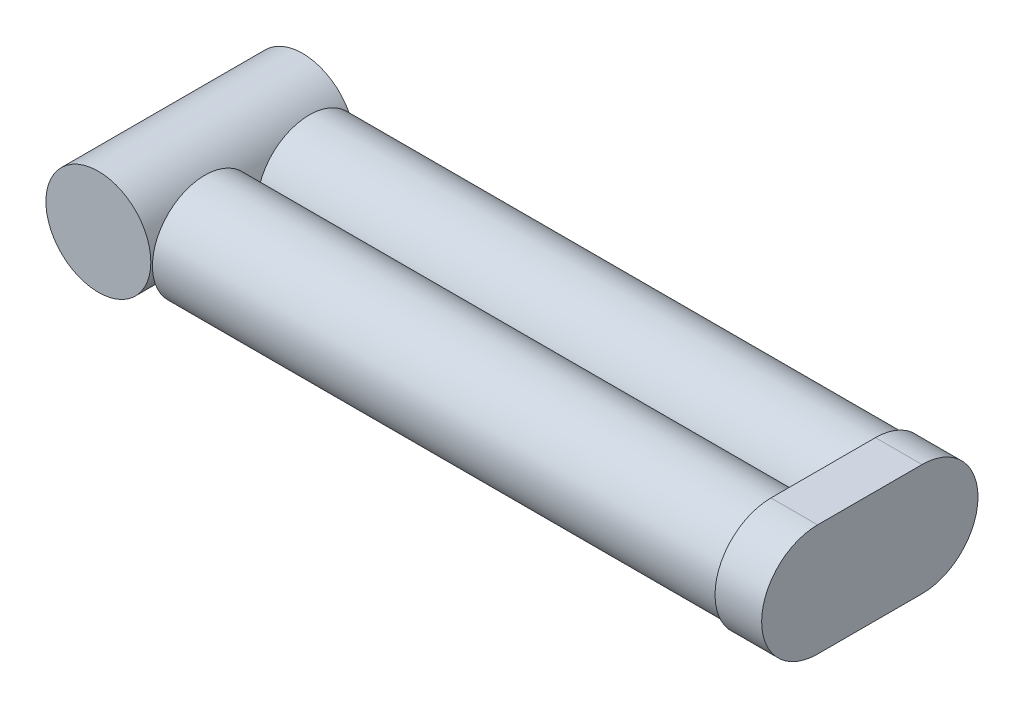
ISO-10303-21;
HEADER;
FILE_DESCRIPTION(('STEP AP214'),'2;1');
FILE_NAME('part.step','',(''),(''),'','','');
FILE_SCHEMA(('AUTOMOTIVE_DESIGN { 1 0 10303 214 1 1 1 1 }'));
ENDSEC;
DATA;
#1=APPLICATION_CONTEXT('core data for automotive mechanical design processes');
#2=APPLICATION_PROTOCOL_DEFINITION('international standard','automotive_design',2000,#1);
#3=PRODUCT_CONTEXT('',#1,'mechanical');
#4=PRODUCT('Part','Part','',(#3));
#5=PRODUCT_RELATED_PRODUCT_CATEGORY('part','',(#4));
#6=PRODUCT_DEFINITION_FORMATION('','',#4);
#7=PRODUCT_DEFINITION_CONTEXT('part definition',#1,'design');
#8=PRODUCT_DEFINITION('design','',#6,#7);
#9=PRODUCT_DEFINITION_SHAPE('','',#8);
#10=(LENGTH_UNIT() NAMED_UNIT(*) SI_UNIT(.MILLI.,.METRE.));
#11=(NAMED_UNIT(*) PLANE_ANGLE_UNIT() SI_UNIT($,.RADIAN.));
#12=(NAMED_UNIT(*) SI_UNIT($,.STERADIAN.) SOLID_ANGLE_UNIT());
#13=UNCERTAINTY_MEASURE_WITH_UNIT(LENGTH_MEASURE(1.E-05),#10,'distance_accuracy_value','');
#14=(GEOMETRIC_REPRESENTATION_CONTEXT(3) GLOBAL_UNCERTAINTY_ASSIGNED_CONTEXT((#13)) GLOBAL_UNIT_ASSIGNED_CONTEXT((#10,
#11,#12)) REPRESENTATION_CONTEXT('',''));
#15=CARTESIAN_POINT('',(0.,0.,0.));
#16=DIRECTION('',(0.,0.,1.));
#17=DIRECTION('',(1.,0.,0.));
#18=AXIS2_PLACEMENT_3D('',#15,#16,#17);
#19=CARTESIAN_POINT('',(-12.15,0.,21.9));
#20=DIRECTION('',(0.,0.,-1.));
#21=DIRECTION('',(-1.,0.,0.));
#22=AXIS2_PLACEMENT_3D('',#19,#20,#21);
#23=CYLINDRICAL_SURFACE('',#22,11.25);
#24=CARTESIAN_POINT('',(-12.15,0.,21.9));
#25=DIRECTION('',(0.,0.,1.));
#26=DIRECTION('',(1.,0.,0.));
#27=AXIS2_PLACEMENT_3D('',#24,#25,#26);
#28=CIRCLE('',#27,11.25);
#29=CARTESIAN_POINT('',(-0.90000000000001,0.,21.9));
#30=VERTEX_POINT('',#29);
#31=EDGE_CURVE('E11',#30,#30,#28,.T.);
#32=ORIENTED_EDGE('',*,*,#31,.F.);
#33=EDGE_LOOP('',(#32));
#34=FACE_BOUND('',#33,.T.);
#35=CARTESIAN_POINT('',(-12.15,0.,-21.9));
#36=DIRECTION('',(0.,0.,1.));
#37=DIRECTION('',(1.,0.,0.));
#38=AXIS2_PLACEMENT_3D('',#35,#36,#37);
#39=CIRCLE('',#38,11.25);
#40=CARTESIAN_POINT('',(-0.90000000000001,0.,-21.9));
#41=VERTEX_POINT('',#40);
#42=EDGE_CURVE('E55',#41,#41,#39,.T.);
#43=ORIENTED_EDGE('',*,*,#42,.T.);
#44=EDGE_LOOP('',(#43));
#45=FACE_BOUND('',#44,.T.);
#46=ADVANCED_FACE('F52',(#34,#45),#23,.T.);
#47=CARTESIAN_POINT('',(-12.15,0.,21.9));
#48=DIRECTION('',(0.,0.,1.));
#49=DIRECTION('',(1.,0.,0.));
#50=AXIS2_PLACEMENT_3D('',#47,#48,#49);
#51=PLANE('',#50);
#52=ORIENTED_EDGE('',*,*,#31,.T.);
#53=EDGE_LOOP('',(#52));
#54=FACE_BOUND('',#53,.T.);
#55=ADVANCED_FACE('F67',(#54),#51,.T.);
#56=CARTESIAN_POINT('',(-12.15,0.,-21.9));
#57=DIRECTION('',(0.,0.,1.));
#58=DIRECTION('',(1.,0.,0.));
#59=AXIS2_PLACEMENT_3D('',#56,#57,#58);
#60=PLANE('',#59);
#61=ORIENTED_EDGE('',*,*,#42,.F.);
#62=EDGE_LOOP('',(#61));
#63=FACE_BOUND('',#62,.T.);
#64=ADVANCED_FACE('F65',(#63),#60,.F.);
#65=CLOSED_SHELL('',(#46,#55,#64));
#66=MANIFOLD_SOLID_BREP('B2',#65);
#67=CARTESIAN_POINT('',(130.4,0.,-11.2));
#68=DIRECTION('',(1.,0.,0.));
#69=DIRECTION('',(0.,0.,-1.));
#70=AXIS2_PLACEMENT_3D('',#67,#68,#69);
#71=PLANE('',#70);
#72=CARTESIAN_POINT('',(130.4,0.,-11.2));
#73=DIRECTION('',(1.,0.,0.));
#74=DIRECTION('',(0.,0.,-1.));
#75=AXIS2_PLACEMENT_3D('',#72,#73,#74);
#76=CIRCLE('',#75,11.25);
#77=CARTESIAN_POINT('',(130.4,-11.,-8.84150471698584));
#78=VERTEX_POINT('',#77);
#79=CARTESIAN_POINT('',(130.4,-1.05948100502087,0.));
#80=VERTEX_POINT('',#79);
#81=EDGE_CURVE('E267',#78,#80,#76,.F.);
#82=ORIENTED_EDGE('',*,*,#81,.F.);
#83=DIRECTION('',(0.,0.,1.));
#84=VECTOR('',#83,1.);
#85=CARTESIAN_POINT('',(130.4,-11.,-11.2));
#86=LINE('',#85,#84);
#87=CARTESIAN_POINT('',(130.4,-11.,8.84150471698586));
#88=VERTEX_POINT('',#87);
#89=EDGE_CURVE('E324',#78,#88,#86,.T.);
#90=ORIENTED_EDGE('',*,*,#89,.T.);
#91=CARTESIAN_POINT('',(130.4,0.,11.2));
#92=DIRECTION('',(1.,0.,0.));
#93=DIRECTION('',(0.,0.,-1.));
#94=AXIS2_PLACEMENT_3D('',#91,#92,#93);
#95=CIRCLE('',#94,11.25);
#96=EDGE_CURVE('E118',#88,#80,#95,.T.);
#97=ORIENTED_EDGE('',*,*,#96,.T.);
#98=EDGE_LOOP('',(#82,#90,#97));
#99=FACE_BOUND('',#98,.T.);
#100=ADVANCED_FACE('F94',(#99),#71,.F.);
#101=CARTESIAN_POINT('',(131.4,0.,11.2));
#102=DIRECTION('',(-1.,0.,0.));
#103=DIRECTION('',(0.,0.,1.));
#104=AXIS2_PLACEMENT_3D('',#101,#102,#103);
#105=CYLINDRICAL_SURFACE('',#104,11.25);
#106=ORIENTED_EDGE('',*,*,#96,.F.);
#107=DIRECTION('',(-1.,0.,0.));
#108=VECTOR('',#107,1.);
#109=CARTESIAN_POINT('',(131.4,-11.,8.84150471698586));
#110=LINE('',#109,#108);
#111=CARTESIAN_POINT('',(121.4,-11.,8.84150471698586));
#112=VERTEX_POINT('',#111);
#113=EDGE_CURVE('E223',#88,#112,#110,.T.);
#114=ORIENTED_EDGE('',*,*,#113,.T.);
#115=CARTESIAN_POINT('',(121.4,0.,11.2));
#116=DIRECTION('',(1.,0.,0.));
#117=DIRECTION('',(0.,0.,-1.));
#118=AXIS2_PLACEMENT_3D('',#115,#116,#117);
#119=CIRCLE('',#118,11.25);
#120=CARTESIAN_POINT('',(121.4,11.,8.84150471698588));
#121=VERTEX_POINT('',#120);
#122=EDGE_CURVE('E227',#121,#112,#119,.T.);
#123=ORIENTED_EDGE('',*,*,#122,.F.);
#124=DIRECTION('',(-1.,0.,0.));
#125=VECTOR('',#124,1.);
#126=CARTESIAN_POINT('',(131.4,11.,8.84150471698588));
#127=LINE('',#126,#125);
#128=CARTESIAN_POINT('',(130.4,11.,8.84150471698588));
#129=VERTEX_POINT('',#128);
#130=EDGE_CURVE('E216',#121,#129,#127,.F.);
#131=ORIENTED_EDGE('',*,*,#130,.T.);
#132=CARTESIAN_POINT('',(130.4,1.05948100502087,0.));
#133=VERTEX_POINT('',#132);
#134=EDGE_CURVE('E250',#133,#129,#95,.T.);
#135=ORIENTED_EDGE('',*,*,#134,.F.);
#136=DIRECTION('',(-1.,0.,0.));
#137=VECTOR('',#136,1.);
#138=CARTESIAN_POINT('',(131.4,1.05948100502087,0.));
#139=LINE('',#138,#137);
#140=CARTESIAN_POINT('',(0.,1.05948100502087,0.));
#141=VERTEX_POINT('',#140);
#142=EDGE_CURVE('E262',#133,#141,#139,.T.);
#143=ORIENTED_EDGE('',*,*,#142,.T.);
#144=CARTESIAN_POINT('',(0.,0.,11.2));
#145=DIRECTION('',(1.,0.,0.));
#146=DIRECTION('',(0.,0.,-1.));
#147=AXIS2_PLACEMENT_3D('',#144,#145,#146);
#148=CIRCLE('',#147,11.25);
#149=CARTESIAN_POINT('',(0.,-1.05948100502087,0.));
#150=VERTEX_POINT('',#149);
#151=EDGE_CURVE('E254',#141,#150,#148,.T.);
#152=ORIENTED_EDGE('',*,*,#151,.T.);
#153=DIRECTION('',(-1.,0.,0.));
#154=VECTOR('',#153,1.);
#155=CARTESIAN_POINT('',(131.4,-1.05948100502087,0.));
#156=LINE('',#155,#154);
#157=EDGE_CURVE('E265',#80,#150,#156,.T.);
#158=ORIENTED_EDGE('',*,*,#157,.F.);
#159=EDGE_LOOP('',(#106,#114,#123,#131,#135,#143,#152,#158));
#160=FACE_BOUND('',#159,.T.);
#161=ADVANCED_FACE('F96',(#160),#105,.T.);
#162=CARTESIAN_POINT('',(131.4,0.,-11.2));
#163=DIRECTION('',(-1.,0.,0.));
#164=DIRECTION('',(0.,0.,1.));
#165=AXIS2_PLACEMENT_3D('',#162,#163,#164);
#166=CYLINDRICAL_SURFACE('',#165,11.25);
#167=DIRECTION('',(-1.,0.,0.));
#168=VECTOR('',#167,1.);
#169=CARTESIAN_POINT('',(131.4,-11.,-8.84150471698584));
#170=LINE('',#169,#168);
#171=CARTESIAN_POINT('',(121.4,-11.,-8.84150471698584));
#172=VERTEX_POINT('',#171);
#173=EDGE_CURVE('E220',#78,#172,#170,.T.);
#174=ORIENTED_EDGE('',*,*,#173,.F.);
#175=ORIENTED_EDGE('',*,*,#81,.T.);
#176=ORIENTED_EDGE('',*,*,#157,.T.);
#177=CARTESIAN_POINT('',(0.,0.,-11.2));
#178=DIRECTION('',(1.,0.,0.));
#179=DIRECTION('',(0.,0.,-1.));
#180=AXIS2_PLACEMENT_3D('',#177,#178,#179);
#181=CIRCLE('',#180,11.25);
#182=EDGE_CURVE('E258',#141,#150,#181,.F.);
#183=ORIENTED_EDGE('',*,*,#182,.F.);
#184=ORIENTED_EDGE('',*,*,#142,.F.);
#185=CARTESIAN_POINT('',(130.4,11.,-8.84150471698584));
#186=VERTEX_POINT('',#185);
#187=EDGE_CURVE('E103',#133,#186,#76,.F.);
#188=ORIENTED_EDGE('',*,*,#187,.T.);
#189=DIRECTION('',(-1.,0.,0.));
#190=VECTOR('',#189,1.);
#191=CARTESIAN_POINT('',(131.4,11.,-8.84150471698584));
#192=LINE('',#191,#190);
#193=CARTESIAN_POINT('',(121.4,11.,-8.84150471698584));
#194=VERTEX_POINT('',#193);
#195=EDGE_CURVE('E110',#194,#186,#192,.F.);
#196=ORIENTED_EDGE('',*,*,#195,.F.);
#197=CARTESIAN_POINT('',(121.4,0.,-11.2));
#198=DIRECTION('',(1.,0.,0.));
#199=DIRECTION('',(0.,0.,-1.));
#200=AXIS2_PLACEMENT_3D('',#197,#198,#199);
#201=CIRCLE('',#200,11.25);
#202=EDGE_CURVE('E50',#194,#172,#201,.F.);
#203=ORIENTED_EDGE('',*,*,#202,.T.);
#204=EDGE_LOOP('',(#174,#175,#176,#183,#184,#188,#196,#203));
#205=FACE_BOUND('',#204,.T.);
#206=ADVANCED_FACE('F275',(#205),#166,.T.);
#207=CARTESIAN_POINT('',(0.,0.,0.));
#208=DIRECTION('',(1.,0.,0.));
#209=DIRECTION('',(0.,0.,-1.));
#210=AXIS2_PLACEMENT_3D('',#207,#208,#209);
#211=PLANE('',#210);
#212=ORIENTED_EDGE('',*,*,#151,.F.);
#213=ORIENTED_EDGE('',*,*,#182,.T.);
#214=EDGE_LOOP('',(#212,#213));
#215=FACE_BOUND('',#214,.T.);
#216=ADVANCED_FACE('F281',(#215),#211,.F.);
#217=ORIENTED_EDGE('',*,*,#134,.T.);
#218=DIRECTION('',(0.,0.,-1.));
#219=VECTOR('',#218,1.);
#220=CARTESIAN_POINT('',(130.4,11.,11.2));
#221=LINE('',#220,#219);
#222=EDGE_CURVE('E322',#129,#186,#221,.T.);
#223=ORIENTED_EDGE('',*,*,#222,.T.);
#224=ORIENTED_EDGE('',*,*,#187,.F.);
#225=EDGE_LOOP('',(#217,#223,#224));
#226=FACE_BOUND('',#225,.T.);
#227=ADVANCED_FACE('F283',(#226),#71,.F.);
#228=CARTESIAN_POINT('',(121.4,0.,0.));
#229=DIRECTION('',(1.,0.,0.));
#230=DIRECTION('',(0.,0.,-1.));
#231=AXIS2_PLACEMENT_3D('',#228,#229,#230);
#232=PLANE('',#231);
#233=DIRECTION('',(0.,0.,-1.));
#234=VECTOR('',#233,1.);
#235=CARTESIAN_POINT('',(121.4,-12.,-11.2));
#236=LINE('',#235,#234);
#237=CARTESIAN_POINT('',(121.4,-12.,11.2));
#238=VERTEX_POINT('',#237);
#239=CARTESIAN_POINT('',(121.4,-12.,-11.2));
#240=VERTEX_POINT('',#239);
#241=EDGE_CURVE('E178',#238,#240,#236,.T.);
#242=ORIENTED_EDGE('',*,*,#241,.F.);
#243=CARTESIAN_POINT('',(121.4,0.,11.2));
#244=DIRECTION('',(1.,0.,0.));
#245=DIRECTION('',(0.,0.,-1.));
#246=AXIS2_PLACEMENT_3D('',#243,#244,#245);
#247=CIRCLE('',#246,12.);
#248=CARTESIAN_POINT('',(121.4,12.,11.2));
#249=VERTEX_POINT('',#248);
#250=EDGE_CURVE('E195',#249,#238,#247,.T.);
#251=ORIENTED_EDGE('',*,*,#250,.F.);
#252=DIRECTION('',(0.,0.,1.));
#253=VECTOR('',#252,1.);
#254=CARTESIAN_POINT('',(121.4,12.,11.2));
#255=LINE('',#254,#253);
#256=CARTESIAN_POINT('',(121.4,12.,-11.2));
#257=VERTEX_POINT('',#256);
#258=EDGE_CURVE('E203',#257,#249,#255,.T.);
#259=ORIENTED_EDGE('',*,*,#258,.F.);
#260=CARTESIAN_POINT('',(121.4,0.,-11.2));
#261=DIRECTION('',(1.,0.,0.));
#262=DIRECTION('',(0.,0.,-1.));
#263=AXIS2_PLACEMENT_3D('',#260,#261,#262);
#264=CIRCLE('',#263,12.);
#265=EDGE_CURVE('E198',#240,#257,#264,.T.);
#266=ORIENTED_EDGE('',*,*,#265,.F.);
#267=EDGE_LOOP('',(#242,#251,#259,#266));
#268=FACE_BOUND('',#267,.T.);
#269=DIRECTION('',(0.,0.,1.));
#270=VECTOR('',#269,1.);
#271=CARTESIAN_POINT('',(121.4,11.,11.2));
#272=LINE('',#271,#270);
#273=EDGE_CURVE('E206',#194,#121,#272,.T.);
#274=ORIENTED_EDGE('',*,*,#273,.T.);
#275=ORIENTED_EDGE('',*,*,#122,.T.);
#276=DIRECTION('',(0.,0.,-1.));
#277=VECTOR('',#276,1.);
#278=CARTESIAN_POINT('',(121.4,-11.,-11.2));
#279=LINE('',#278,#277);
#280=EDGE_CURVE('E210',#112,#172,#279,.T.);
#281=ORIENTED_EDGE('',*,*,#280,.T.);
#282=ORIENTED_EDGE('',*,*,#202,.F.);
#283=EDGE_LOOP('',(#274,#275,#281,#282));
#284=FACE_BOUND('',#283,.T.);
#285=ADVANCED_FACE('F192',(#268,#284),#232,.F.);
#286=CARTESIAN_POINT('',(59.1605513045936,-11.,-11.2));
#287=DIRECTION('',(0.,1.,0.));
#288=DIRECTION('',(0.,0.,1.));
#289=AXIS2_PLACEMENT_3D('',#286,#287,#288);
#290=PLANE('',#289);
#291=ORIENTED_EDGE('',*,*,#113,.F.);
#292=ORIENTED_EDGE('',*,*,#89,.F.);
#293=ORIENTED_EDGE('',*,*,#173,.T.);
#294=ORIENTED_EDGE('',*,*,#280,.F.);
#295=EDGE_LOOP('',(#291,#292,#293,#294));
#296=FACE_BOUND('',#295,.T.);
#297=ADVANCED_FACE('F317',(#296),#290,.T.);
#298=CARTESIAN_POINT('',(59.1605513045936,11.,11.2));
#299=DIRECTION('',(0.,-1.,0.));
#300=DIRECTION('',(0.,0.,-1.));
#301=AXIS2_PLACEMENT_3D('',#298,#299,#300);
#302=PLANE('',#301);
#303=ORIENTED_EDGE('',*,*,#130,.F.);
#304=ORIENTED_EDGE('',*,*,#273,.F.);
#305=ORIENTED_EDGE('',*,*,#195,.T.);
#306=ORIENTED_EDGE('',*,*,#222,.F.);
#307=EDGE_LOOP('',(#303,#304,#305,#306));
#308=FACE_BOUND('',#307,.T.);
#309=ADVANCED_FACE('F312',(#308),#302,.T.);
#310=CARTESIAN_POINT('',(131.4,0.,0.));
#311=DIRECTION('',(1.,0.,0.));
#312=DIRECTION('',(0.,0.,-1.));
#313=AXIS2_PLACEMENT_3D('',#310,#311,#312);
#314=PLANE('',#313);
#315=CARTESIAN_POINT('',(131.4,0.,-11.2));
#316=DIRECTION('',(1.,0.,0.));
#317=DIRECTION('',(0.,0.,-1.));
#318=AXIS2_PLACEMENT_3D('',#315,#316,#317);
#319=CIRCLE('',#318,12.);
#320=CARTESIAN_POINT('',(131.4,-12.,-11.2));
#321=VERTEX_POINT('',#320);
#322=CARTESIAN_POINT('',(131.4,12.,-11.2));
#323=VERTEX_POINT('',#322);
#324=EDGE_CURVE('E230',#321,#323,#319,.T.);
#325=ORIENTED_EDGE('',*,*,#324,.T.);
#326=DIRECTION('',(0.,0.,1.));
#327=VECTOR('',#326,1.);
#328=CARTESIAN_POINT('',(131.4,12.,-11.2));
#329=LINE('',#328,#327);
#330=CARTESIAN_POINT('',(131.4,12.,11.2));
#331=VERTEX_POINT('',#330);
#332=EDGE_CURVE('E234',#323,#331,#329,.T.);
#333=ORIENTED_EDGE('',*,*,#332,.T.);
#334=CARTESIAN_POINT('',(131.4,0.,11.2));
#335=DIRECTION('',(1.,0.,0.));
#336=DIRECTION('',(0.,0.,-1.));
#337=AXIS2_PLACEMENT_3D('',#334,#335,#336);
#338=CIRCLE('',#337,12.);
#339=CARTESIAN_POINT('',(131.4,-12.,11.2));
#340=VERTEX_POINT('',#339);
#341=EDGE_CURVE('E238',#331,#340,#338,.T.);
#342=ORIENTED_EDGE('',*,*,#341,.T.);
#343=DIRECTION('',(0.,0.,-1.));
#344=VECTOR('',#343,1.);
#345=CARTESIAN_POINT('',(131.4,-12.,-11.2));
#346=LINE('',#345,#344);
#347=EDGE_CURVE('E180',#340,#321,#346,.T.);
#348=ORIENTED_EDGE('',*,*,#347,.T.);
#349=EDGE_LOOP('',(#325,#333,#342,#348));
#350=FACE_BOUND('',#349,.T.);
#351=ADVANCED_FACE('F307',(#350),#314,.T.);
#352=CARTESIAN_POINT('',(130.4,12.,-11.2));
#353=DIRECTION('',(0.,1.,0.));
#354=DIRECTION('',(0.,0.,1.));
#355=AXIS2_PLACEMENT_3D('',#352,#353,#354);
#356=PLANE('',#355);
#357=ORIENTED_EDGE('',*,*,#332,.F.);
#358=DIRECTION('',(1.,0.,0.));
#359=VECTOR('',#358,1.);
#360=CARTESIAN_POINT('',(130.4,12.,-11.2));
#361=LINE('',#360,#359);
#362=EDGE_CURVE('E243',#257,#323,#361,.T.);
#363=ORIENTED_EDGE('',*,*,#362,.F.);
#364=ORIENTED_EDGE('',*,*,#258,.T.);
#365=DIRECTION('',(1.,0.,0.));
#366=VECTOR('',#365,1.);
#367=CARTESIAN_POINT('',(130.4,12.,11.2));
#368=LINE('',#367,#366);
#369=EDGE_CURVE('E187',#249,#331,#368,.T.);
#370=ORIENTED_EDGE('',*,*,#369,.T.);
#371=EDGE_LOOP('',(#357,#363,#364,#370));
#372=FACE_BOUND('',#371,.T.);
#373=ADVANCED_FACE('F304',(#372),#356,.T.);
#374=CARTESIAN_POINT('',(130.4,0.,11.2));
#375=DIRECTION('',(1.,0.,0.));
#376=DIRECTION('',(0.,0.,-1.));
#377=AXIS2_PLACEMENT_3D('',#374,#375,#376);
#378=CYLINDRICAL_SURFACE('',#377,12.);
#379=ORIENTED_EDGE('',*,*,#341,.F.);
#380=ORIENTED_EDGE('',*,*,#369,.F.);
#381=ORIENTED_EDGE('',*,*,#250,.T.);
#382=DIRECTION('',(1.,0.,0.));
#383=VECTOR('',#382,1.);
#384=CARTESIAN_POINT('',(130.4,-12.,11.2));
#385=LINE('',#384,#383);
#386=EDGE_CURVE('E175',#238,#340,#385,.T.);
#387=ORIENTED_EDGE('',*,*,#386,.T.);
#388=EDGE_LOOP('',(#379,#380,#381,#387));
#389=FACE_BOUND('',#388,.T.);
#390=ADVANCED_FACE('F201',(#389),#378,.T.);
#391=CARTESIAN_POINT('',(130.4,-12.,-11.2));
#392=DIRECTION('',(0.,-1.,0.));
#393=DIRECTION('',(0.,0.,-1.));
#394=AXIS2_PLACEMENT_3D('',#391,#392,#393);
#395=PLANE('',#394);
#396=ORIENTED_EDGE('',*,*,#347,.F.);
#397=ORIENTED_EDGE('',*,*,#386,.F.);
#398=ORIENTED_EDGE('',*,*,#241,.T.);
#399=DIRECTION('',(1.,0.,0.));
#400=VECTOR('',#399,1.);
#401=CARTESIAN_POINT('',(130.4,-12.,-11.2));
#402=LINE('',#401,#400);
#403=EDGE_CURVE('E186',#240,#321,#402,.T.);
#404=ORIENTED_EDGE('',*,*,#403,.T.);
#405=EDGE_LOOP('',(#396,#397,#398,#404));
#406=FACE_BOUND('',#405,.T.);
#407=ADVANCED_FACE('F177',(#406),#395,.T.);
#408=CARTESIAN_POINT('',(130.4,0.,-11.2));
#409=DIRECTION('',(1.,0.,0.));
#410=DIRECTION('',(0.,0.,-1.));
#411=AXIS2_PLACEMENT_3D('',#408,#409,#410);
#412=CYLINDRICAL_SURFACE('',#411,12.);
#413=ORIENTED_EDGE('',*,*,#324,.F.);
#414=ORIENTED_EDGE('',*,*,#403,.F.);
#415=ORIENTED_EDGE('',*,*,#265,.T.);
#416=ORIENTED_EDGE('',*,*,#362,.T.);
#417=EDGE_LOOP('',(#413,#414,#415,#416));
#418=FACE_BOUND('',#417,.T.);
#419=ADVANCED_FACE('F301',(#418),#412,.T.);
#420=CLOSED_SHELL('',(#100,#161,#206,#216,#227,#285,#297,#309,#351,#373,#390,#407,#419));
#421=MANIFOLD_SOLID_BREP('B6',#420);
#422=ADVANCED_BREP_SHAPE_REPRESENTATION('',(#18,#66,#421),#14);
#423=SHAPE_DEFINITION_REPRESENTATION(#9,#422);
ENDSEC;
END-ISO-10303-21;
